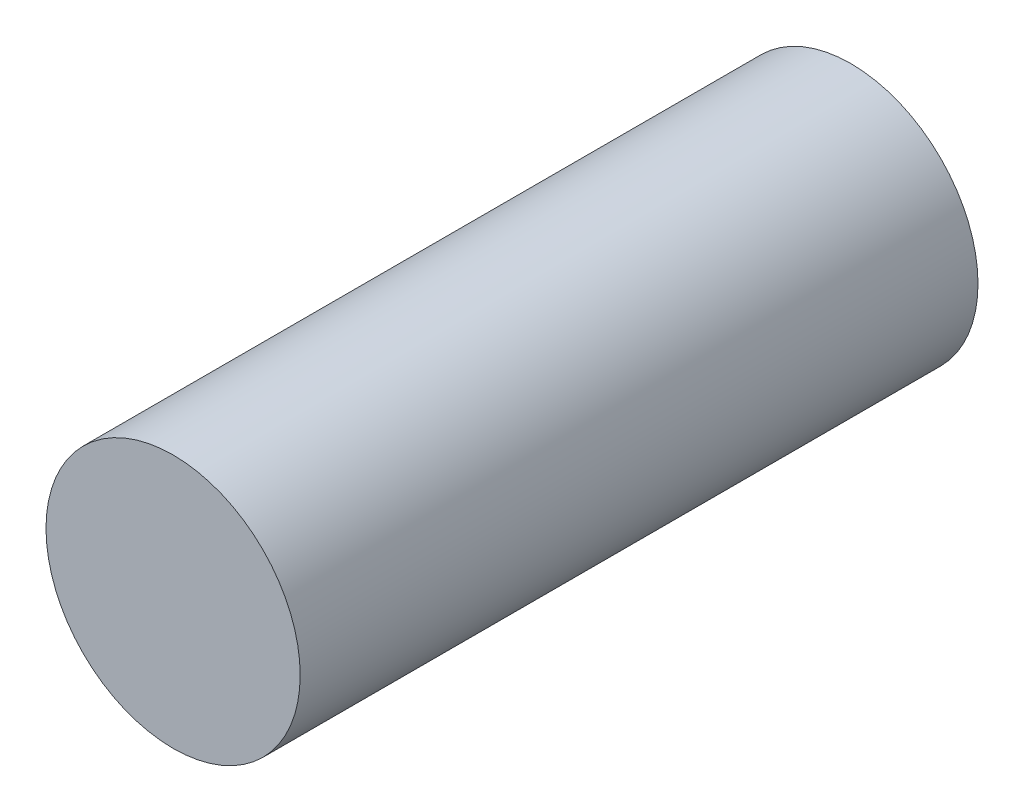
ISO-10303-21;
HEADER;
FILE_DESCRIPTION(('STEP AP214'),'2;1');
FILE_NAME('part.step','',(''),(''),'','','');
FILE_SCHEMA(('AUTOMOTIVE_DESIGN { 1 0 10303 214 1 1 1 1 }'));
ENDSEC;
DATA;
#1=APPLICATION_CONTEXT('core data for automotive mechanical design processes');
#2=APPLICATION_PROTOCOL_DEFINITION('international standard','automotive_design',2000,#1);
#3=PRODUCT_CONTEXT('',#1,'mechanical');
#4=PRODUCT('Part','Part','',(#3));
#5=PRODUCT_RELATED_PRODUCT_CATEGORY('part','',(#4));
#6=PRODUCT_DEFINITION_FORMATION('','',#4);
#7=PRODUCT_DEFINITION_CONTEXT('part definition',#1,'design');
#8=PRODUCT_DEFINITION('design','',#6,#7);
#9=PRODUCT_DEFINITION_SHAPE('','',#8);
#10=(LENGTH_UNIT() NAMED_UNIT(*) SI_UNIT(.MILLI.,.METRE.));
#11=(NAMED_UNIT(*) PLANE_ANGLE_UNIT() SI_UNIT($,.RADIAN.));
#12=(NAMED_UNIT(*) SI_UNIT($,.STERADIAN.) SOLID_ANGLE_UNIT());
#13=UNCERTAINTY_MEASURE_WITH_UNIT(LENGTH_MEASURE(1.E-05),#10,'distance_accuracy_value','');
#14=(GEOMETRIC_REPRESENTATION_CONTEXT(3) GLOBAL_UNCERTAINTY_ASSIGNED_CONTEXT((#13)) GLOBAL_UNIT_ASSIGNED_CONTEXT((#10,
#11,#12)) REPRESENTATION_CONTEXT('',''));
#15=CARTESIAN_POINT('',(0.,0.,0.));
#16=DIRECTION('',(0.,0.,1.));
#17=DIRECTION('',(1.,0.,0.));
#18=AXIS2_PLACEMENT_3D('',#15,#16,#17);
#19=CARTESIAN_POINT('',(0.,0.,16.));
#20=DIRECTION('',(0.,0.,-1.));
#21=DIRECTION('',(-1.,0.,0.));
#22=AXIS2_PLACEMENT_3D('',#19,#20,#21);
#23=CYLINDRICAL_SURFACE('',#22,3.);
#24=CARTESIAN_POINT('',(0.,0.,16.));
#25=DIRECTION('',(0.,0.,1.));
#26=DIRECTION('',(1.,0.,0.));
#27=AXIS2_PLACEMENT_3D('',#24,#25,#26);
#28=CIRCLE('',#27,3.);
#29=CARTESIAN_POINT('',(3.,0.,16.));
#30=VERTEX_POINT('',#29);
#31=EDGE_CURVE('E10',#30,#30,#28,.T.);
#32=ORIENTED_EDGE('',*,*,#31,.F.);
#33=EDGE_LOOP('',(#32));
#34=FACE_BOUND('',#33,.T.);
#35=CARTESIAN_POINT('',(0.,0.,0.));
#36=DIRECTION('',(0.,0.,1.));
#37=DIRECTION('',(1.,0.,0.));
#38=AXIS2_PLACEMENT_3D('',#35,#36,#37);
#39=CIRCLE('',#38,3.);
#40=CARTESIAN_POINT('',(3.,0.,0.));
#41=VERTEX_POINT('',#40);
#42=EDGE_CURVE('E44',#41,#41,#39,.T.);
#43=ORIENTED_EDGE('',*,*,#42,.T.);
#44=EDGE_LOOP('',(#43));
#45=FACE_BOUND('',#44,.T.);
#46=ADVANCED_FACE('F41',(#34,#45),#23,.T.);
#47=CARTESIAN_POINT('',(0.,0.,16.));
#48=DIRECTION('',(0.,0.,1.));
#49=DIRECTION('',(1.,0.,0.));
#50=AXIS2_PLACEMENT_3D('',#47,#48,#49);
#51=PLANE('',#50);
#52=ORIENTED_EDGE('',*,*,#31,.T.);
#53=EDGE_LOOP('',(#52));
#54=FACE_BOUND('',#53,.T.);
#55=ADVANCED_FACE('F58',(#54),#51,.T.);
#56=CARTESIAN_POINT('',(0.,0.,0.));
#57=DIRECTION('',(0.,0.,1.));
#58=DIRECTION('',(1.,0.,0.));
#59=AXIS2_PLACEMENT_3D('',#56,#57,#58);
#60=PLANE('',#59);
#61=ORIENTED_EDGE('',*,*,#42,.F.);
#62=EDGE_LOOP('',(#61));
#63=FACE_BOUND('',#62,.T.);
#64=ADVANCED_FACE('F56',(#63),#60,.F.);
#65=CLOSED_SHELL('',(#46,#55,#64));
#66=MANIFOLD_SOLID_BREP('B2',#65);
#67=ADVANCED_BREP_SHAPE_REPRESENTATION('',(#18,#66),#14);
#68=SHAPE_DEFINITION_REPRESENTATION(#9,#67);
ENDSEC;
END-ISO-10303-21;
